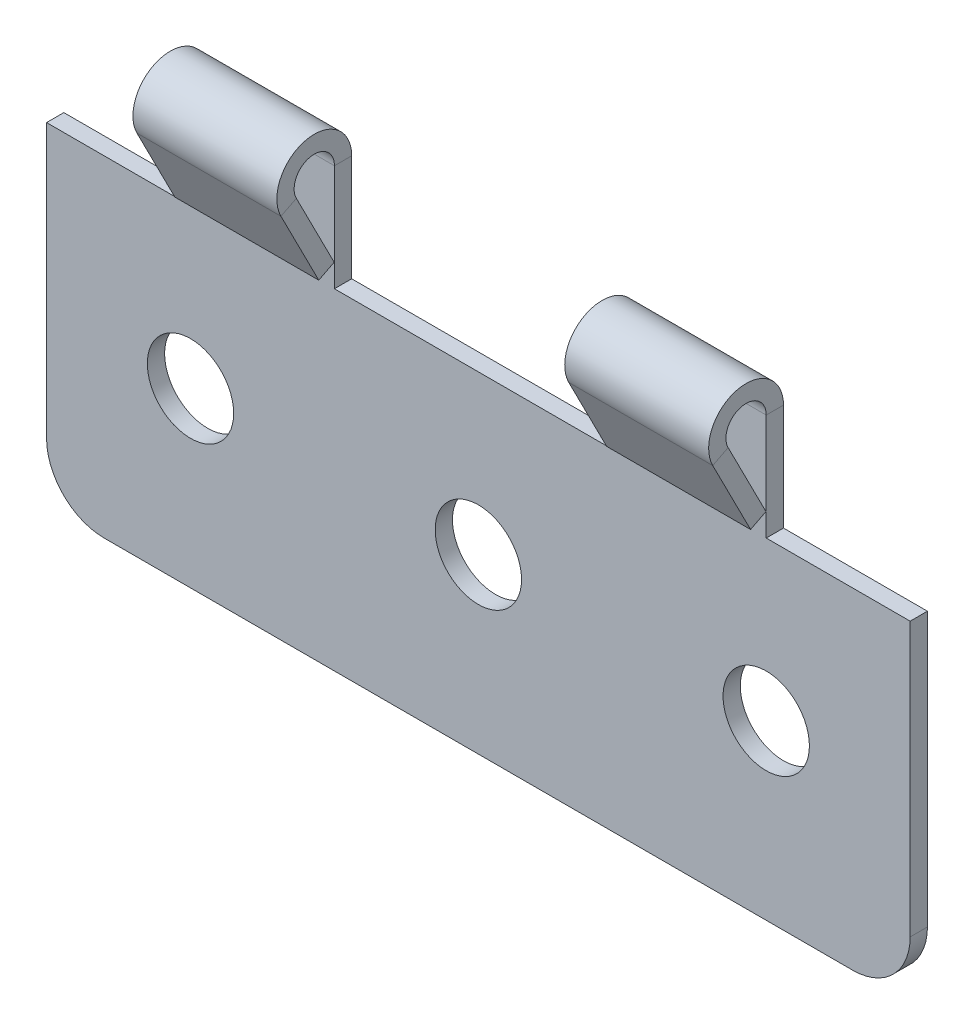
ISO-10303-21;
HEADER;
FILE_DESCRIPTION(('STEP AP214'),'2;1');
FILE_NAME('part.step','',(''),(''),'','','');
FILE_SCHEMA(('AUTOMOTIVE_DESIGN { 1 0 10303 214 1 1 1 1 }'));
ENDSEC;
DATA;
#1=APPLICATION_CONTEXT('core data for automotive mechanical design processes');
#2=APPLICATION_PROTOCOL_DEFINITION('international standard','automotive_design',2000,#1);
#3=PRODUCT_CONTEXT('',#1,'mechanical');
#4=PRODUCT('Part','Part','',(#3));
#5=PRODUCT_RELATED_PRODUCT_CATEGORY('part','',(#4));
#6=PRODUCT_DEFINITION_FORMATION('','',#4);
#7=PRODUCT_DEFINITION_CONTEXT('part definition',#1,'design');
#8=PRODUCT_DEFINITION('design','',#6,#7);
#9=PRODUCT_DEFINITION_SHAPE('','',#8);
#10=(LENGTH_UNIT() NAMED_UNIT(*) SI_UNIT(.MILLI.,.METRE.));
#11=(NAMED_UNIT(*) PLANE_ANGLE_UNIT() SI_UNIT($,.RADIAN.));
#12=(NAMED_UNIT(*) SI_UNIT($,.STERADIAN.) SOLID_ANGLE_UNIT());
#13=UNCERTAINTY_MEASURE_WITH_UNIT(LENGTH_MEASURE(1.E-05),#10,'distance_accuracy_value','');
#14=(GEOMETRIC_REPRESENTATION_CONTEXT(3) GLOBAL_UNCERTAINTY_ASSIGNED_CONTEXT((#13)) GLOBAL_UNIT_ASSIGNED_CONTEXT((#10,
#11,#12)) REPRESENTATION_CONTEXT('',''));
#15=CARTESIAN_POINT('',(0.,0.,0.));
#16=DIRECTION('',(0.,0.,1.));
#17=DIRECTION('',(1.,0.,0.));
#18=AXIS2_PLACEMENT_3D('',#15,#16,#17);
#19=CARTESIAN_POINT('',(200.,165.,-6.));
#20=DIRECTION('',(-1.,0.,0.));
#21=DIRECTION('',(0.,0.,1.));
#22=AXIS2_PLACEMENT_3D('',#19,#20,#21);
#23=PLANE('',#22);
#24=DIRECTION('',(0.,-1.,0.));
#25=VECTOR('',#24,1.);
#26=CARTESIAN_POINT('',(200.,165.,0.));
#27=LINE('',#26,#25);
#28=CARTESIAN_POINT('',(200.,152.,0.));
#29=VERTEX_POINT('',#28);
#30=CARTESIAN_POINT('',(200.,115.,0.));
#31=VERTEX_POINT('',#30);
#32=EDGE_CURVE('E331',#29,#31,#27,.T.);
#33=ORIENTED_EDGE('',*,*,#32,.F.);
#34=DIRECTION('',(0.,0.,-1.));
#35=VECTOR('',#34,1.);
#36=CARTESIAN_POINT('',(200.,152.,0.));
#37=LINE('',#36,#35);
#38=CARTESIAN_POINT('',(200.,152.,-6.00000000000003));
#39=VERTEX_POINT('',#38);
#40=EDGE_CURVE('E254',#29,#39,#37,.T.);
#41=ORIENTED_EDGE('',*,*,#40,.T.);
#42=DIRECTION('',(0.,-1.,0.));
#43=VECTOR('',#42,1.);
#44=CARTESIAN_POINT('',(200.,165.,-6.));
#45=LINE('',#44,#43);
#46=CARTESIAN_POINT('',(200.,115.,-6.));
#47=VERTEX_POINT('',#46);
#48=EDGE_CURVE('E274',#39,#47,#45,.T.);
#49=ORIENTED_EDGE('',*,*,#48,.T.);
#50=DIRECTION('',(0.,0.,1.));
#51=VECTOR('',#50,1.);
#52=CARTESIAN_POINT('',(200.,115.,-6.));
#53=LINE('',#52,#51);
#54=EDGE_CURVE('E348',#47,#31,#53,.T.);
#55=ORIENTED_EDGE('',*,*,#54,.T.);
#56=EDGE_LOOP('',(#33,#41,#49,#55));
#57=FACE_BOUND('',#56,.T.);
#58=ADVANCED_FACE('F49',(#57),#23,.T.);
#59=CARTESIAN_POINT('',(50.,115.,-6.));
#60=DIRECTION('',(-1.,0.,0.));
#61=DIRECTION('',(0.,-1.,0.));
#62=AXIS2_PLACEMENT_3D('',#59,#60,#61);
#63=PLANE('',#62);
#64=DIRECTION('',(0.,-1.,0.));
#65=VECTOR('',#64,1.);
#66=CARTESIAN_POINT('',(50.,115.,0.));
#67=LINE('',#66,#65);
#68=CARTESIAN_POINT('',(50.,152.,0.));
#69=VERTEX_POINT('',#68);
#70=CARTESIAN_POINT('',(50.,115.,0.));
#71=VERTEX_POINT('',#70);
#72=EDGE_CURVE('E342',#69,#71,#67,.T.);
#73=ORIENTED_EDGE('',*,*,#72,.F.);
#74=DIRECTION('',(0.,0.,-1.));
#75=VECTOR('',#74,1.);
#76=CARTESIAN_POINT('',(50.,152.,0.));
#77=LINE('',#76,#75);
#78=CARTESIAN_POINT('',(50.,152.,-5.99999999999998));
#79=VERTEX_POINT('',#78);
#80=EDGE_CURVE('E621',#69,#79,#77,.T.);
#81=ORIENTED_EDGE('',*,*,#80,.T.);
#82=DIRECTION('',(0.,-1.,0.));
#83=VECTOR('',#82,1.);
#84=CARTESIAN_POINT('',(50.,115.,-6.));
#85=LINE('',#84,#83);
#86=CARTESIAN_POINT('',(50.,115.,-6.));
#87=VERTEX_POINT('',#86);
#88=EDGE_CURVE('E299',#79,#87,#85,.T.);
#89=ORIENTED_EDGE('',*,*,#88,.T.);
#90=DIRECTION('',(0.,0.,1.));
#91=VECTOR('',#90,1.);
#92=CARTESIAN_POINT('',(50.,115.,-6.));
#93=LINE('',#92,#91);
#94=EDGE_CURVE('E11',#87,#71,#93,.T.);
#95=ORIENTED_EDGE('',*,*,#94,.T.);
#96=EDGE_LOOP('',(#73,#81,#89,#95));
#97=FACE_BOUND('',#96,.T.);
#98=ADVANCED_FACE('F385',(#97),#63,.T.);
#99=CARTESIAN_POINT('',(50.,115.,-6.));
#100=DIRECTION('',(0.,1.,0.));
#101=DIRECTION('',(-1.,0.,0.));
#102=AXIS2_PLACEMENT_3D('',#99,#100,#101);
#103=PLANE('',#102);
#104=DIRECTION('',(-1.,0.,0.));
#105=VECTOR('',#104,1.);
#106=CARTESIAN_POINT('',(50.,115.,0.));
#107=LINE('',#106,#105);
#108=CARTESIAN_POINT('',(0.,115.,0.));
#109=VERTEX_POINT('',#108);
#110=EDGE_CURVE('E302',#71,#109,#107,.T.);
#111=ORIENTED_EDGE('',*,*,#110,.F.);
#112=ORIENTED_EDGE('',*,*,#94,.F.);
#113=DIRECTION('',(-1.,0.,0.));
#114=VECTOR('',#113,1.);
#115=CARTESIAN_POINT('',(50.,115.,-6.));
#116=LINE('',#115,#114);
#117=CARTESIAN_POINT('',(0.,115.,-6.));
#118=VERTEX_POINT('',#117);
#119=EDGE_CURVE('E344',#87,#118,#116,.T.);
#120=ORIENTED_EDGE('',*,*,#119,.T.);
#121=DIRECTION('',(0.,0.,1.));
#122=VECTOR('',#121,1.);
#123=CARTESIAN_POINT('',(0.,115.,-6.));
#124=LINE('',#123,#122);
#125=EDGE_CURVE('E53',#118,#109,#124,.T.);
#126=ORIENTED_EDGE('',*,*,#125,.T.);
#127=EDGE_LOOP('',(#111,#112,#120,#126));
#128=FACE_BOUND('',#127,.T.);
#129=ADVANCED_FACE('F51',(#128),#103,.T.);
#130=CARTESIAN_POINT('',(100.,165.,-6.));
#131=DIRECTION('',(1.,0.,0.));
#132=DIRECTION('',(0.,0.,-1.));
#133=AXIS2_PLACEMENT_3D('',#130,#131,#132);
#134=PLANE('',#133);
#135=DIRECTION('',(0.,0.,-1.));
#136=VECTOR('',#135,1.);
#137=CARTESIAN_POINT('',(100.,152.,0.));
#138=LINE('',#137,#136);
#139=CARTESIAN_POINT('',(100.,152.,0.));
#140=VERTEX_POINT('',#139);
#141=CARTESIAN_POINT('',(100.,152.,-5.99999999999998));
#142=VERTEX_POINT('',#141);
#143=EDGE_CURVE('E633',#140,#142,#138,.T.);
#144=ORIENTED_EDGE('',*,*,#143,.F.);
#145=DIRECTION('',(0.,1.,0.));
#146=VECTOR('',#145,1.);
#147=CARTESIAN_POINT('',(100.,165.,0.));
#148=LINE('',#147,#146);
#149=CARTESIAN_POINT('',(100.,115.,0.));
#150=VERTEX_POINT('',#149);
#151=EDGE_CURVE('E338',#150,#140,#148,.T.);
#152=ORIENTED_EDGE('',*,*,#151,.F.);
#153=DIRECTION('',(0.,0.,1.));
#154=VECTOR('',#153,1.);
#155=CARTESIAN_POINT('',(100.,115.,-6.));
#156=LINE('',#155,#154);
#157=CARTESIAN_POINT('',(100.,115.,-6.));
#158=VERTEX_POINT('',#157);
#159=EDGE_CURVE('E59',#158,#150,#156,.T.);
#160=ORIENTED_EDGE('',*,*,#159,.F.);
#161=DIRECTION('',(0.,1.,0.));
#162=VECTOR('',#161,1.);
#163=CARTESIAN_POINT('',(100.,165.,-6.));
#164=LINE('',#163,#162);
#165=EDGE_CURVE('E295',#158,#142,#164,.T.);
#166=ORIENTED_EDGE('',*,*,#165,.T.);
#167=EDGE_LOOP('',(#144,#152,#160,#166));
#168=FACE_BOUND('',#167,.T.);
#169=ADVANCED_FACE('F449',(#168),#134,.T.);
#170=CARTESIAN_POINT('',(200.,115.,-6.));
#171=DIRECTION('',(0.,1.,0.));
#172=DIRECTION('',(0.,0.,1.));
#173=AXIS2_PLACEMENT_3D('',#170,#171,#172);
#174=PLANE('',#173);
#175=DIRECTION('',(-1.,0.,0.));
#176=VECTOR('',#175,1.);
#177=CARTESIAN_POINT('',(200.,115.,0.));
#178=LINE('',#177,#176);
#179=EDGE_CURVE('E334',#31,#150,#178,.T.);
#180=ORIENTED_EDGE('',*,*,#179,.F.);
#181=ORIENTED_EDGE('',*,*,#54,.F.);
#182=DIRECTION('',(-1.,0.,0.));
#183=VECTOR('',#182,1.);
#184=CARTESIAN_POINT('',(200.,115.,-6.));
#185=LINE('',#184,#183);
#186=EDGE_CURVE('E285',#47,#158,#185,.T.);
#187=ORIENTED_EDGE('',*,*,#186,.T.);
#188=ORIENTED_EDGE('',*,*,#159,.T.);
#189=EDGE_LOOP('',(#180,#181,#187,#188));
#190=FACE_BOUND('',#189,.T.);
#191=ADVANCED_FACE('F435',(#190),#174,.T.);
#192=CARTESIAN_POINT('',(250.,115.,-6.));
#193=DIRECTION('',(1.,0.,0.));
#194=DIRECTION('',(0.,0.,-1.));
#195=AXIS2_PLACEMENT_3D('',#192,#193,#194);
#196=PLANE('',#195);
#197=DIRECTION('',(0.,0.,-1.));
#198=VECTOR('',#197,1.);
#199=CARTESIAN_POINT('',(250.,152.,0.));
#200=LINE('',#199,#198);
#201=CARTESIAN_POINT('',(250.,152.,0.));
#202=VERTEX_POINT('',#201);
#203=CARTESIAN_POINT('',(250.,152.,-6.00000000000003));
#204=VERTEX_POINT('',#203);
#205=EDGE_CURVE('E241',#202,#204,#200,.T.);
#206=ORIENTED_EDGE('',*,*,#205,.F.);
#207=DIRECTION('',(0.,1.,0.));
#208=VECTOR('',#207,1.);
#209=CARTESIAN_POINT('',(250.,115.,0.));
#210=LINE('',#209,#208);
#211=CARTESIAN_POINT('',(250.,115.,0.));
#212=VERTEX_POINT('',#211);
#213=EDGE_CURVE('E328',#212,#202,#210,.T.);
#214=ORIENTED_EDGE('',*,*,#213,.F.);
#215=DIRECTION('',(0.,0.,1.));
#216=VECTOR('',#215,1.);
#217=CARTESIAN_POINT('',(250.,115.,-6.));
#218=LINE('',#217,#216);
#219=CARTESIAN_POINT('',(250.,115.,-6.));
#220=VERTEX_POINT('',#219);
#221=EDGE_CURVE('E279',#220,#212,#218,.T.);
#222=ORIENTED_EDGE('',*,*,#221,.F.);
#223=DIRECTION('',(0.,1.,0.));
#224=VECTOR('',#223,1.);
#225=CARTESIAN_POINT('',(250.,115.,-6.));
#226=LINE('',#225,#224);
#227=EDGE_CURVE('E271',#220,#204,#226,.T.);
#228=ORIENTED_EDGE('',*,*,#227,.T.);
#229=EDGE_LOOP('',(#206,#214,#222,#228));
#230=FACE_BOUND('',#229,.T.);
#231=ADVANCED_FACE('F278',(#230),#196,.T.);
#232=CARTESIAN_POINT('',(300.,115.,-6.));
#233=DIRECTION('',(0.,1.,0.));
#234=DIRECTION('',(0.,0.,1.));
#235=AXIS2_PLACEMENT_3D('',#232,#233,#234);
#236=PLANE('',#235);
#237=DIRECTION('',(-1.,0.,0.));
#238=VECTOR('',#237,1.);
#239=CARTESIAN_POINT('',(300.,115.,0.));
#240=LINE('',#239,#238);
#241=CARTESIAN_POINT('',(300.,115.,0.));
#242=VERTEX_POINT('',#241);
#243=EDGE_CURVE('E324',#242,#212,#240,.T.);
#244=ORIENTED_EDGE('',*,*,#243,.F.);
#245=DIRECTION('',(0.,0.,1.));
#246=VECTOR('',#245,1.);
#247=CARTESIAN_POINT('',(300.,115.,-6.));
#248=LINE('',#247,#246);
#249=CARTESIAN_POINT('',(300.,115.,-6.));
#250=VERTEX_POINT('',#249);
#251=EDGE_CURVE('E354',#250,#242,#248,.T.);
#252=ORIENTED_EDGE('',*,*,#251,.F.);
#253=DIRECTION('',(-1.,0.,0.));
#254=VECTOR('',#253,1.);
#255=CARTESIAN_POINT('',(300.,115.,-6.));
#256=LINE('',#255,#254);
#257=EDGE_CURVE('E281',#250,#220,#256,.T.);
#258=ORIENTED_EDGE('',*,*,#257,.T.);
#259=ORIENTED_EDGE('',*,*,#221,.T.);
#260=EDGE_LOOP('',(#244,#252,#258,#259));
#261=FACE_BOUND('',#260,.T.);
#262=ADVANCED_FACE('F426',(#261),#236,.T.);
#263=CARTESIAN_POINT('',(300.,20.0000000000001,-6.));
#264=DIRECTION('',(1.,0.,0.));
#265=DIRECTION('',(0.,0.,-1.));
#266=AXIS2_PLACEMENT_3D('',#263,#264,#265);
#267=PLANE('',#266);
#268=DIRECTION('',(0.,1.,0.));
#269=VECTOR('',#268,1.);
#270=CARTESIAN_POINT('',(300.,20.0000000000001,0.));
#271=LINE('',#270,#269);
#272=CARTESIAN_POINT('',(300.,20.,0.));
#273=VERTEX_POINT('',#272);
#274=EDGE_CURVE('E320',#273,#242,#271,.T.);
#275=ORIENTED_EDGE('',*,*,#274,.F.);
#276=DIRECTION('',(0.,0.,1.));
#277=VECTOR('',#276,1.);
#278=CARTESIAN_POINT('',(300.,20.,-6.));
#279=LINE('',#278,#277);
#280=CARTESIAN_POINT('',(300.,20.,-6.));
#281=VERTEX_POINT('',#280);
#282=EDGE_CURVE('E357',#281,#273,#279,.T.);
#283=ORIENTED_EDGE('',*,*,#282,.F.);
#284=DIRECTION('',(0.,1.,0.));
#285=VECTOR('',#284,1.);
#286=CARTESIAN_POINT('',(300.,20.0000000000001,-6.));
#287=LINE('',#286,#285);
#288=EDGE_CURVE('E288',#281,#250,#287,.T.);
#289=ORIENTED_EDGE('',*,*,#288,.T.);
#290=ORIENTED_EDGE('',*,*,#251,.T.);
#291=EDGE_LOOP('',(#275,#283,#289,#290));
#292=FACE_BOUND('',#291,.T.);
#293=ADVANCED_FACE('F412',(#292),#267,.T.);
#294=CARTESIAN_POINT('',(280.,20.,-6.));
#295=DIRECTION('',(0.,0.,1.));
#296=DIRECTION('',(1.,0.,0.));
#297=AXIS2_PLACEMENT_3D('',#294,#295,#296);
#298=CYLINDRICAL_SURFACE('',#297,20.);
#299=CARTESIAN_POINT('',(280.,20.,0.));
#300=DIRECTION('',(0.,0.,1.));
#301=DIRECTION('',(1.,0.,0.));
#302=AXIS2_PLACEMENT_3D('',#299,#300,#301);
#303=CIRCLE('',#302,20.);
#304=CARTESIAN_POINT('',(280.,0.,0.));
#305=VERTEX_POINT('',#304);
#306=EDGE_CURVE('E317',#305,#273,#303,.T.);
#307=ORIENTED_EDGE('',*,*,#306,.F.);
#308=DIRECTION('',(0.,0.,1.));
#309=VECTOR('',#308,1.);
#310=CARTESIAN_POINT('',(280.,0.,-6.));
#311=LINE('',#310,#309);
#312=CARTESIAN_POINT('',(280.,0.,-6.));
#313=VERTEX_POINT('',#312);
#314=EDGE_CURVE('E359',#313,#305,#311,.T.);
#315=ORIENTED_EDGE('',*,*,#314,.F.);
#316=CARTESIAN_POINT('',(280.,20.,-6.));
#317=DIRECTION('',(0.,0.,1.));
#318=DIRECTION('',(1.,0.,0.));
#319=AXIS2_PLACEMENT_3D('',#316,#317,#318);
#320=CIRCLE('',#319,20.);
#321=EDGE_CURVE('E404',#313,#281,#320,.T.);
#322=ORIENTED_EDGE('',*,*,#321,.T.);
#323=ORIENTED_EDGE('',*,*,#282,.T.);
#324=EDGE_LOOP('',(#307,#315,#322,#323));
#325=FACE_BOUND('',#324,.T.);
#326=ADVANCED_FACE('F418',(#325),#298,.T.);
#327=CARTESIAN_POINT('',(20.0000000000001,0.,-6.));
#328=DIRECTION('',(0.,-1.,0.));
#329=DIRECTION('',(0.,0.,-1.));
#330=AXIS2_PLACEMENT_3D('',#327,#328,#329);
#331=PLANE('',#330);
#332=DIRECTION('',(1.,0.,0.));
#333=VECTOR('',#332,1.);
#334=CARTESIAN_POINT('',(20.0000000000001,0.,0.));
#335=LINE('',#334,#333);
#336=CARTESIAN_POINT('',(20.0000000000001,0.,0.));
#337=VERTEX_POINT('',#336);
#338=EDGE_CURVE('E314',#337,#305,#335,.T.);
#339=ORIENTED_EDGE('',*,*,#338,.F.);
#340=DIRECTION('',(0.,0.,1.));
#341=VECTOR('',#340,1.);
#342=CARTESIAN_POINT('',(20.0000000000001,0.,-6.));
#343=LINE('',#342,#341);
#344=CARTESIAN_POINT('',(20.0000000000001,0.,-6.));
#345=VERTEX_POINT('',#344);
#346=EDGE_CURVE('E362',#345,#337,#343,.T.);
#347=ORIENTED_EDGE('',*,*,#346,.F.);
#348=DIRECTION('',(1.,0.,0.));
#349=VECTOR('',#348,1.);
#350=CARTESIAN_POINT('',(20.0000000000001,0.,-6.));
#351=LINE('',#350,#349);
#352=EDGE_CURVE('E400',#345,#313,#351,.T.);
#353=ORIENTED_EDGE('',*,*,#352,.T.);
#354=ORIENTED_EDGE('',*,*,#314,.T.);
#355=EDGE_LOOP('',(#339,#347,#353,#354));
#356=FACE_BOUND('',#355,.T.);
#357=ADVANCED_FACE('F421',(#356),#331,.T.);
#358=CARTESIAN_POINT('',(20.,20.,-6.));
#359=DIRECTION('',(0.,0.,1.));
#360=DIRECTION('',(1.,0.,0.));
#361=AXIS2_PLACEMENT_3D('',#358,#359,#360);
#362=CYLINDRICAL_SURFACE('',#361,20.);
#363=CARTESIAN_POINT('',(20.,20.,0.));
#364=DIRECTION('',(0.,0.,1.));
#365=DIRECTION('',(-1.,0.,0.));
#366=AXIS2_PLACEMENT_3D('',#363,#364,#365);
#367=CIRCLE('',#366,20.);
#368=CARTESIAN_POINT('',(0.,20.0000000000001,0.));
#369=VERTEX_POINT('',#368);
#370=EDGE_CURVE('E311',#369,#337,#367,.T.);
#371=ORIENTED_EDGE('',*,*,#370,.F.);
#372=DIRECTION('',(0.,0.,1.));
#373=VECTOR('',#372,1.);
#374=CARTESIAN_POINT('',(0.,20.0000000000001,-6.));
#375=LINE('',#374,#373);
#376=CARTESIAN_POINT('',(0.,20.0000000000001,-6.));
#377=VERTEX_POINT('',#376);
#378=EDGE_CURVE('E363',#377,#369,#375,.T.);
#379=ORIENTED_EDGE('',*,*,#378,.F.);
#380=CARTESIAN_POINT('',(20.,20.,-6.));
#381=DIRECTION('',(0.,0.,1.));
#382=DIRECTION('',(-1.,0.,0.));
#383=AXIS2_PLACEMENT_3D('',#380,#381,#382);
#384=CIRCLE('',#383,20.);
#385=EDGE_CURVE('E392',#377,#345,#384,.T.);
#386=ORIENTED_EDGE('',*,*,#385,.T.);
#387=ORIENTED_EDGE('',*,*,#346,.T.);
#388=EDGE_LOOP('',(#371,#379,#386,#387));
#389=FACE_BOUND('',#388,.T.);
#390=ADVANCED_FACE('F423',(#389),#362,.T.);
#391=CARTESIAN_POINT('',(0.,115.,-6.));
#392=DIRECTION('',(-1.,0.,0.));
#393=DIRECTION('',(0.,-1.,0.));
#394=AXIS2_PLACEMENT_3D('',#391,#392,#393);
#395=PLANE('',#394);
#396=DIRECTION('',(0.,-1.,0.));
#397=VECTOR('',#396,1.);
#398=CARTESIAN_POINT('',(0.,115.,0.));
#399=LINE('',#398,#397);
#400=EDGE_CURVE('E306',#109,#369,#399,.T.);
#401=ORIENTED_EDGE('',*,*,#400,.F.);
#402=ORIENTED_EDGE('',*,*,#125,.F.);
#403=DIRECTION('',(0.,-1.,0.));
#404=VECTOR('',#403,1.);
#405=CARTESIAN_POINT('',(0.,115.,-6.));
#406=LINE('',#405,#404);
#407=EDGE_CURVE('E389',#118,#377,#406,.T.);
#408=ORIENTED_EDGE('',*,*,#407,.T.);
#409=ORIENTED_EDGE('',*,*,#378,.T.);
#410=EDGE_LOOP('',(#401,#402,#408,#409));
#411=FACE_BOUND('',#410,.T.);
#412=ADVANCED_FACE('F377',(#411),#395,.T.);
#413=CARTESIAN_POINT('',(20.,20.,-6.));
#414=DIRECTION('',(0.,0.,-1.));
#415=DIRECTION('',(-1.,0.,0.));
#416=AXIS2_PLACEMENT_3D('',#413,#414,#415);
#417=PLANE('',#416);
#418=CARTESIAN_POINT('',(250.,60.,-6.));
#419=DIRECTION('',(0.,0.,-1.));
#420=DIRECTION('',(-1.,0.,0.));
#421=AXIS2_PLACEMENT_3D('',#418,#419,#420);
#422=CIRCLE('',#421,15.);
#423=CARTESIAN_POINT('',(235.,60.,-6.));
#424=VERTEX_POINT('',#423);
#425=EDGE_CURVE('E537',#424,#424,#422,.T.);
#426=ORIENTED_EDGE('',*,*,#425,.F.);
#427=EDGE_LOOP('',(#426));
#428=FACE_BOUND('',#427,.T.);
#429=CARTESIAN_POINT('',(150.,60.,-6.));
#430=DIRECTION('',(0.,0.,-1.));
#431=DIRECTION('',(-1.,0.,0.));
#432=AXIS2_PLACEMENT_3D('',#429,#430,#431);
#433=CIRCLE('',#432,15.);
#434=CARTESIAN_POINT('',(135.,60.,-6.));
#435=VERTEX_POINT('',#434);
#436=EDGE_CURVE('E548',#435,#435,#433,.T.);
#437=ORIENTED_EDGE('',*,*,#436,.F.);
#438=EDGE_LOOP('',(#437));
#439=FACE_BOUND('',#438,.T.);
#440=CARTESIAN_POINT('',(50.,60.,-6.));
#441=DIRECTION('',(0.,0.,-1.));
#442=DIRECTION('',(-1.,0.,0.));
#443=AXIS2_PLACEMENT_3D('',#440,#441,#442);
#444=CIRCLE('',#443,15.);
#445=CARTESIAN_POINT('',(35.,60.,-6.));
#446=VERTEX_POINT('',#445);
#447=EDGE_CURVE('E542',#446,#446,#444,.T.);
#448=ORIENTED_EDGE('',*,*,#447,.F.);
#449=EDGE_LOOP('',(#448));
#450=FACE_BOUND('',#449,.T.);
#451=DIRECTION('',(-1.,0.,0.));
#452=VECTOR('',#451,1.);
#453=CARTESIAN_POINT('',(200.,152.,-6.00000000000003));
#454=LINE('',#453,#452);
#455=EDGE_CURVE('E261',#39,#204,#454,.F.);
#456=ORIENTED_EDGE('',*,*,#455,.T.);
#457=ORIENTED_EDGE('',*,*,#227,.F.);
#458=ORIENTED_EDGE('',*,*,#257,.F.);
#459=ORIENTED_EDGE('',*,*,#288,.F.);
#460=ORIENTED_EDGE('',*,*,#321,.F.);
#461=ORIENTED_EDGE('',*,*,#352,.F.);
#462=ORIENTED_EDGE('',*,*,#385,.F.);
#463=ORIENTED_EDGE('',*,*,#407,.F.);
#464=ORIENTED_EDGE('',*,*,#119,.F.);
#465=ORIENTED_EDGE('',*,*,#88,.F.);
#466=DIRECTION('',(-1.,0.,0.));
#467=VECTOR('',#466,1.);
#468=CARTESIAN_POINT('',(50.,152.,-5.99999999999998));
#469=LINE('',#468,#467);
#470=EDGE_CURVE('E613',#79,#142,#469,.F.);
#471=ORIENTED_EDGE('',*,*,#470,.T.);
#472=ORIENTED_EDGE('',*,*,#165,.F.);
#473=ORIENTED_EDGE('',*,*,#186,.F.);
#474=ORIENTED_EDGE('',*,*,#48,.F.);
#475=EDGE_LOOP('',(#456,#457,#458,#459,#460,#461,#462,#463,#464,#465,#471,#472,#473,#474));
#476=FACE_BOUND('',#475,.T.);
#477=ADVANCED_FACE('F269',(#428,#439,#450,#476),#417,.T.);
#478=CARTESIAN_POINT('',(20.,20.,0.));
#479=DIRECTION('',(0.,0.,-1.));
#480=DIRECTION('',(-1.,0.,0.));
#481=AXIS2_PLACEMENT_3D('',#478,#479,#480);
#482=PLANE('',#481);
#483=CARTESIAN_POINT('',(250.,60.,0.));
#484=DIRECTION('',(0.,0.,1.));
#485=DIRECTION('',(1.,0.,0.));
#486=AXIS2_PLACEMENT_3D('',#483,#484,#485);
#487=CIRCLE('',#486,15.);
#488=CARTESIAN_POINT('',(265.,60.,0.));
#489=VERTEX_POINT('',#488);
#490=EDGE_CURVE('E540',#489,#489,#487,.T.);
#491=ORIENTED_EDGE('',*,*,#490,.F.);
#492=EDGE_LOOP('',(#491));
#493=FACE_BOUND('',#492,.T.);
#494=CARTESIAN_POINT('',(150.,60.,0.));
#495=DIRECTION('',(0.,0.,1.));
#496=DIRECTION('',(1.,0.,0.));
#497=AXIS2_PLACEMENT_3D('',#494,#495,#496);
#498=CIRCLE('',#497,15.);
#499=CARTESIAN_POINT('',(165.,60.,0.));
#500=VERTEX_POINT('',#499);
#501=EDGE_CURVE('E543',#500,#500,#498,.T.);
#502=ORIENTED_EDGE('',*,*,#501,.F.);
#503=EDGE_LOOP('',(#502));
#504=FACE_BOUND('',#503,.T.);
#505=CARTESIAN_POINT('',(50.,60.,0.));
#506=DIRECTION('',(0.,0.,1.));
#507=DIRECTION('',(1.,0.,0.));
#508=AXIS2_PLACEMENT_3D('',#505,#506,#507);
#509=CIRCLE('',#508,15.);
#510=CARTESIAN_POINT('',(65.,60.,0.));
#511=VERTEX_POINT('',#510);
#512=EDGE_CURVE('E552',#511,#511,#509,.T.);
#513=ORIENTED_EDGE('',*,*,#512,.F.);
#514=EDGE_LOOP('',(#513));
#515=FACE_BOUND('',#514,.T.);
#516=ORIENTED_EDGE('',*,*,#213,.T.);
#517=DIRECTION('',(-1.,0.,0.));
#518=VECTOR('',#517,1.);
#519=CARTESIAN_POINT('',(200.,152.,0.));
#520=LINE('',#519,#518);
#521=EDGE_CURVE('E566',#29,#202,#520,.F.);
#522=ORIENTED_EDGE('',*,*,#521,.F.);
#523=ORIENTED_EDGE('',*,*,#32,.T.);
#524=ORIENTED_EDGE('',*,*,#179,.T.);
#525=ORIENTED_EDGE('',*,*,#151,.T.);
#526=DIRECTION('',(-1.,0.,0.));
#527=VECTOR('',#526,1.);
#528=CARTESIAN_POINT('',(50.,152.,0.));
#529=LINE('',#528,#527);
#530=EDGE_CURVE('E382',#69,#140,#529,.F.);
#531=ORIENTED_EDGE('',*,*,#530,.F.);
#532=ORIENTED_EDGE('',*,*,#72,.T.);
#533=ORIENTED_EDGE('',*,*,#110,.T.);
#534=ORIENTED_EDGE('',*,*,#400,.T.);
#535=ORIENTED_EDGE('',*,*,#370,.T.);
#536=ORIENTED_EDGE('',*,*,#338,.T.);
#537=ORIENTED_EDGE('',*,*,#306,.T.);
#538=ORIENTED_EDGE('',*,*,#274,.T.);
#539=ORIENTED_EDGE('',*,*,#243,.T.);
#540=EDGE_LOOP('',(#516,#522,#523,#524,#525,#531,#532,#533,#534,#535,#536,#537,#538,#539));
#541=FACE_BOUND('',#540,.T.);
#542=ADVANCED_FACE('F379',(#493,#504,#515,#541),#482,.F.);
#543=CARTESIAN_POINT('',(50.,133.197641709576,12.0099610297632));
#544=DIRECTION('',(1.,0.,0.));
#545=DIRECTION('',(0.,0.891006524188364,0.453990499739555));
#546=AXIS2_PLACEMENT_3D('',#543,#544,#545);
#547=PLANE('',#546);
#548=DIRECTION('',(0.,-0.453990499739555,0.891006524188364));
#549=VECTOR('',#548,1.);
#550=CARTESIAN_POINT('',(50.,146.098123503386,18.5830848144487));
#551=LINE('',#550,#549);
#552=CARTESIAN_POINT('',(50.,148.822066501823,13.2370456693186));
#553=VERTEX_POINT('',#552);
#554=CARTESIAN_POINT('',(50.,146.098123503386,18.5830848144487));
#555=VERTEX_POINT('',#554);
#556=EDGE_CURVE('E672',#553,#555,#551,.T.);
#557=ORIENTED_EDGE('',*,*,#556,.F.);
#558=DIRECTION('',(0.,-0.891006524188364,-0.453990499739555));
#559=VECTOR('',#558,1.);
#560=CARTESIAN_POINT('',(50.,135.921584708014,6.66392188463302));
#561=LINE('',#560,#559);
#562=CARTESIAN_POINT('',(50.,123.021102914204,0.0907980999474778));
#563=VERTEX_POINT('',#562);
#564=EDGE_CURVE('E659',#563,#553,#561,.F.);
#565=ORIENTED_EDGE('',*,*,#564,.F.);
#566=DIRECTION('',(0.,-0.453990499739555,0.891006524188364));
#567=VECTOR('',#566,1.);
#568=CARTESIAN_POINT('',(50.,120.297159915767,5.43683724507766));
#569=LINE('',#568,#567);
#570=CARTESIAN_POINT('',(50.,120.297159915767,5.43683724507766));
#571=VERTEX_POINT('',#570);
#572=EDGE_CURVE('E669',#563,#571,#569,.T.);
#573=ORIENTED_EDGE('',*,*,#572,.T.);
#574=DIRECTION('',(0.,0.891006524188364,0.453990499739555));
#575=VECTOR('',#574,1.);
#576=CARTESIAN_POINT('',(50.,133.197641709576,12.0099610297632));
#577=LINE('',#576,#575);
#578=EDGE_CURVE('E643',#571,#555,#577,.T.);
#579=ORIENTED_EDGE('',*,*,#578,.T.);
#580=EDGE_LOOP('',(#557,#565,#573,#579));
#581=FACE_BOUND('',#580,.T.);
#582=ADVANCED_FACE('F456',(#581),#547,.F.);
#583=CARTESIAN_POINT('',(75.,120.297159915767,5.43683724507766));
#584=DIRECTION('',(0.,0.891006524188364,0.453990499739555));
#585=DIRECTION('',(-1.,0.,0.));
#586=AXIS2_PLACEMENT_3D('',#583,#584,#585);
#587=PLANE('',#586);
#588=ORIENTED_EDGE('',*,*,#572,.F.);
#589=DIRECTION('',(1.,0.,0.));
#590=VECTOR('',#589,1.);
#591=CARTESIAN_POINT('',(75.,123.021102914204,0.0907980999474778));
#592=LINE('',#591,#590);
#593=CARTESIAN_POINT('',(100.,123.021102914204,0.0907980999474778));
#594=VERTEX_POINT('',#593);
#595=EDGE_CURVE('E655',#594,#563,#592,.F.);
#596=ORIENTED_EDGE('',*,*,#595,.F.);
#597=DIRECTION('',(0.,-0.453990499739555,0.891006524188364));
#598=VECTOR('',#597,1.);
#599=CARTESIAN_POINT('',(100.,120.297159915767,5.43683724507766));
#600=LINE('',#599,#598);
#601=CARTESIAN_POINT('',(100.,120.297159915767,5.43683724507766));
#602=VERTEX_POINT('',#601);
#603=EDGE_CURVE('E395',#594,#602,#600,.T.);
#604=ORIENTED_EDGE('',*,*,#603,.T.);
#605=DIRECTION('',(-1.,0.,0.));
#606=VECTOR('',#605,1.);
#607=CARTESIAN_POINT('',(75.,120.297159915767,5.43683724507766));
#608=LINE('',#607,#606);
#609=EDGE_CURVE('E639',#602,#571,#608,.T.);
#610=ORIENTED_EDGE('',*,*,#609,.T.);
#611=EDGE_LOOP('',(#588,#596,#604,#610));
#612=FACE_BOUND('',#611,.T.);
#613=ADVANCED_FACE('F465',(#612),#587,.F.);
#614=CARTESIAN_POINT('',(100.,133.197641709576,12.0099610297632));
#615=DIRECTION('',(-1.,0.,0.));
#616=DIRECTION('',(0.,-0.891006524188364,-0.453990499739555));
#617=AXIS2_PLACEMENT_3D('',#614,#615,#616);
#618=PLANE('',#617);
#619=DIRECTION('',(0.,-0.891006524188364,-0.453990499739555));
#620=VECTOR('',#619,1.);
#621=CARTESIAN_POINT('',(100.,135.921584708014,6.66392188463302));
#622=LINE('',#621,#620);
#623=CARTESIAN_POINT('',(100.,148.822066501823,13.2370456693186));
#624=VERTEX_POINT('',#623);
#625=EDGE_CURVE('E636',#624,#594,#622,.T.);
#626=ORIENTED_EDGE('',*,*,#625,.F.);
#627=DIRECTION('',(0.,-0.453990499739555,0.891006524188364));
#628=VECTOR('',#627,1.);
#629=CARTESIAN_POINT('',(100.,146.098123503386,18.5830848144487));
#630=LINE('',#629,#628);
#631=CARTESIAN_POINT('',(100.,146.098123503386,18.5830848144487));
#632=VERTEX_POINT('',#631);
#633=EDGE_CURVE('E307',#624,#632,#630,.T.);
#634=ORIENTED_EDGE('',*,*,#633,.T.);
#635=DIRECTION('',(0.,-0.891006524188364,-0.453990499739555));
#636=VECTOR('',#635,1.);
#637=CARTESIAN_POINT('',(100.,133.197641709576,12.0099610297632));
#638=LINE('',#637,#636);
#639=EDGE_CURVE('E651',#632,#602,#638,.T.);
#640=ORIENTED_EDGE('',*,*,#639,.T.);
#641=ORIENTED_EDGE('',*,*,#603,.F.);
#642=EDGE_LOOP('',(#626,#634,#640,#641));
#643=FACE_BOUND('',#642,.T.);
#644=ADVANCED_FACE('F461',(#643),#618,.F.);
#645=CARTESIAN_POINT('',(75.,133.197641709576,12.0099610297632));
#646=DIRECTION('',(0.,-0.453990499739555,0.891006524188364));
#647=DIRECTION('',(0.,-0.891006524188364,-0.453990499739555));
#648=AXIS2_PLACEMENT_3D('',#645,#646,#647);
#649=PLANE('',#648);
#650=ORIENTED_EDGE('',*,*,#609,.F.);
#651=ORIENTED_EDGE('',*,*,#639,.F.);
#652=DIRECTION('',(1.,0.,0.));
#653=VECTOR('',#652,1.);
#654=CARTESIAN_POINT('',(75.,146.098123503386,18.5830848144487));
#655=LINE('',#654,#653);
#656=EDGE_CURVE('E647',#555,#632,#655,.T.);
#657=ORIENTED_EDGE('',*,*,#656,.F.);
#658=ORIENTED_EDGE('',*,*,#578,.F.);
#659=EDGE_LOOP('',(#650,#651,#657,#658));
#660=FACE_BOUND('',#659,.T.);
#661=ADVANCED_FACE('F464',(#660),#649,.T.);
#662=CARTESIAN_POINT('',(75.,135.921584708014,6.66392188463302));
#663=DIRECTION('',(0.,-0.453990499739555,0.891006524188364));
#664=DIRECTION('',(0.,-0.891006524188364,-0.453990499739555));
#665=AXIS2_PLACEMENT_3D('',#662,#663,#664);
#666=PLANE('',#665);
#667=ORIENTED_EDGE('',*,*,#595,.T.);
#668=ORIENTED_EDGE('',*,*,#564,.T.);
#669=DIRECTION('',(1.,0.,0.));
#670=VECTOR('',#669,1.);
#671=CARTESIAN_POINT('',(75.,148.822066501823,13.2370456693186));
#672=LINE('',#671,#670);
#673=EDGE_CURVE('E663',#553,#624,#672,.T.);
#674=ORIENTED_EDGE('',*,*,#673,.T.);
#675=ORIENTED_EDGE('',*,*,#625,.T.);
#676=EDGE_LOOP('',(#667,#668,#674,#675));
#677=FACE_BOUND('',#676,.T.);
#678=ADVANCED_FACE('F473',(#677),#666,.F.);
#679=CARTESIAN_POINT('',(100.,152.,7.00000000000002));
#680=DIRECTION('',(1.,0.,0.));
#681=DIRECTION('',(0.,0.,-1.));
#682=AXIS2_PLACEMENT_3D('',#679,#680,#681);
#683=PLANE('',#682);
#684=ORIENTED_EDGE('',*,*,#633,.F.);
#685=CARTESIAN_POINT('',(100.,152.,7.00000000000002));
#686=DIRECTION('',(-1.,0.,0.));
#687=DIRECTION('',(0.,0.,1.));
#688=AXIS2_PLACEMENT_3D('',#685,#686,#687);
#689=CIRCLE('',#688,6.99999999999999);
#690=EDGE_CURVE('E625',#140,#624,#689,.F.);
#691=ORIENTED_EDGE('',*,*,#690,.F.);
#692=ORIENTED_EDGE('',*,*,#143,.T.);
#693=CARTESIAN_POINT('',(100.,152.,7.00000000000002));
#694=DIRECTION('',(-1.,0.,0.));
#695=DIRECTION('',(0.,0.,1.));
#696=AXIS2_PLACEMENT_3D('',#693,#694,#695);
#697=CIRCLE('',#696,13.);
#698=EDGE_CURVE('E616',#142,#632,#697,.F.);
#699=ORIENTED_EDGE('',*,*,#698,.T.);
#700=EDGE_LOOP('',(#684,#691,#692,#699));
#701=FACE_BOUND('',#700,.T.);
#702=ADVANCED_FACE('F476',(#701),#683,.T.);
#703=CARTESIAN_POINT('',(50.,152.,7.00000000000002));
#704=DIRECTION('',(1.,0.,0.));
#705=DIRECTION('',(0.,0.,-1.));
#706=AXIS2_PLACEMENT_3D('',#703,#704,#705);
#707=PLANE('',#706);
#708=CARTESIAN_POINT('',(50.,152.,7.00000000000002));
#709=DIRECTION('',(-1.,0.,0.));
#710=DIRECTION('',(0.,0.,1.));
#711=AXIS2_PLACEMENT_3D('',#708,#709,#710);
#712=CIRCLE('',#711,6.99999999999999);
#713=EDGE_CURVE('E81',#553,#69,#712,.T.);
#714=ORIENTED_EDGE('',*,*,#713,.F.);
#715=ORIENTED_EDGE('',*,*,#556,.T.);
#716=CARTESIAN_POINT('',(50.,152.,7.00000000000002));
#717=DIRECTION('',(-1.,0.,0.));
#718=DIRECTION('',(0.,0.,1.));
#719=AXIS2_PLACEMENT_3D('',#716,#717,#718);
#720=CIRCLE('',#719,13.);
#721=EDGE_CURVE('E617',#555,#79,#720,.T.);
#722=ORIENTED_EDGE('',*,*,#721,.T.);
#723=ORIENTED_EDGE('',*,*,#80,.F.);
#724=EDGE_LOOP('',(#714,#715,#722,#723));
#725=FACE_BOUND('',#724,.T.);
#726=ADVANCED_FACE('F481',(#725),#707,.F.);
#727=CARTESIAN_POINT('',(50.,152.,7.00000000000002));
#728=DIRECTION('',(-1.,0.,0.));
#729=DIRECTION('',(0.,-0.453990499739555,0.891006524188364));
#730=AXIS2_PLACEMENT_3D('',#727,#728,#729);
#731=CYLINDRICAL_SURFACE('',#730,13.);
#732=ORIENTED_EDGE('',*,*,#470,.F.);
#733=ORIENTED_EDGE('',*,*,#721,.F.);
#734=ORIENTED_EDGE('',*,*,#656,.T.);
#735=ORIENTED_EDGE('',*,*,#698,.F.);
#736=EDGE_LOOP('',(#732,#733,#734,#735));
#737=FACE_BOUND('',#736,.T.);
#738=ADVANCED_FACE('F484',(#737),#731,.T.);
#739=CARTESIAN_POINT('',(50.,152.,7.00000000000002));
#740=DIRECTION('',(-1.,0.,0.));
#741=DIRECTION('',(0.,-0.453990499739555,0.891006524188364));
#742=AXIS2_PLACEMENT_3D('',#739,#740,#741);
#743=CYLINDRICAL_SURFACE('',#742,6.99999999999999);
#744=ORIENTED_EDGE('',*,*,#530,.T.);
#745=ORIENTED_EDGE('',*,*,#690,.T.);
#746=ORIENTED_EDGE('',*,*,#673,.F.);
#747=ORIENTED_EDGE('',*,*,#713,.T.);
#748=EDGE_LOOP('',(#744,#745,#746,#747));
#749=FACE_BOUND('',#748,.T.);
#750=ADVANCED_FACE('F489',(#749),#743,.F.);
#751=CARTESIAN_POINT('',(200.,133.197641709576,12.0099610297632));
#752=DIRECTION('',(1.,0.,0.));
#753=DIRECTION('',(0.,0.891006524188365,0.453990499739553));
#754=AXIS2_PLACEMENT_3D('',#751,#752,#753);
#755=PLANE('',#754);
#756=DIRECTION('',(0.,-0.453990499739553,0.891006524188365));
#757=VECTOR('',#756,1.);
#758=CARTESIAN_POINT('',(200.,146.098123503386,18.5830848144487));
#759=LINE('',#758,#757);
#760=CARTESIAN_POINT('',(200.,148.822066501823,13.2370456693186));
#761=VERTEX_POINT('',#760);
#762=CARTESIAN_POINT('',(200.,146.098123503386,18.5830848144487));
#763=VERTEX_POINT('',#762);
#764=EDGE_CURVE('E604',#761,#763,#759,.T.);
#765=ORIENTED_EDGE('',*,*,#764,.F.);
#766=DIRECTION('',(0.,-0.891006524188365,-0.453990499739553));
#767=VECTOR('',#766,1.);
#768=CARTESIAN_POINT('',(200.,135.921584708014,6.66392188463304));
#769=LINE('',#768,#767);
#770=CARTESIAN_POINT('',(200.,123.021102914204,0.0907980999475229));
#771=VERTEX_POINT('',#770);
#772=EDGE_CURVE('E591',#771,#761,#769,.F.);
#773=ORIENTED_EDGE('',*,*,#772,.F.);
#774=DIRECTION('',(0.,-0.453990499739553,0.891006524188365));
#775=VECTOR('',#774,1.);
#776=CARTESIAN_POINT('',(200.,120.297159915767,5.43683724507771));
#777=LINE('',#776,#775);
#778=CARTESIAN_POINT('',(200.,120.297159915767,5.43683724507771));
#779=VERTEX_POINT('',#778);
#780=EDGE_CURVE('E601',#771,#779,#777,.T.);
#781=ORIENTED_EDGE('',*,*,#780,.T.);
#782=DIRECTION('',(0.,0.891006524188365,0.453990499739553));
#783=VECTOR('',#782,1.);
#784=CARTESIAN_POINT('',(200.,133.197641709576,12.0099610297632));
#785=LINE('',#784,#783);
#786=EDGE_CURVE('E579',#779,#763,#785,.T.);
#787=ORIENTED_EDGE('',*,*,#786,.T.);
#788=EDGE_LOOP('',(#765,#773,#781,#787));
#789=FACE_BOUND('',#788,.T.);
#790=ADVANCED_FACE('F492',(#789),#755,.F.);
#791=CARTESIAN_POINT('',(225.,120.297159915767,5.43683724507771));
#792=DIRECTION('',(0.,0.891006524188365,0.453990499739553));
#793=DIRECTION('',(-1.,0.,0.));
#794=AXIS2_PLACEMENT_3D('',#791,#792,#793);
#795=PLANE('',#794);
#796=ORIENTED_EDGE('',*,*,#780,.F.);
#797=DIRECTION('',(1.,0.,0.));
#798=VECTOR('',#797,1.);
#799=CARTESIAN_POINT('',(225.,123.021102914204,0.0907980999475229));
#800=LINE('',#799,#798);
#801=CARTESIAN_POINT('',(250.,123.021102914204,0.0907980999475229));
#802=VERTEX_POINT('',#801);
#803=EDGE_CURVE('E587',#802,#771,#800,.F.);
#804=ORIENTED_EDGE('',*,*,#803,.F.);
#805=DIRECTION('',(0.,-0.453990499739553,0.891006524188365));
#806=VECTOR('',#805,1.);
#807=CARTESIAN_POINT('',(250.,120.297159915767,5.43683724507771));
#808=LINE('',#807,#806);
#809=CARTESIAN_POINT('',(250.,120.297159915767,5.43683724507771));
#810=VERTEX_POINT('',#809);
#811=EDGE_CURVE('E578',#802,#810,#808,.T.);
#812=ORIENTED_EDGE('',*,*,#811,.T.);
#813=DIRECTION('',(-1.,0.,0.));
#814=VECTOR('',#813,1.);
#815=CARTESIAN_POINT('',(225.,120.297159915767,5.43683724507771));
#816=LINE('',#815,#814);
#817=EDGE_CURVE('E574',#810,#779,#816,.T.);
#818=ORIENTED_EDGE('',*,*,#817,.T.);
#819=EDGE_LOOP('',(#796,#804,#812,#818));
#820=FACE_BOUND('',#819,.T.);
#821=ADVANCED_FACE('F499',(#820),#795,.F.);
#822=CARTESIAN_POINT('',(250.,133.197641709576,12.0099610297632));
#823=DIRECTION('',(-1.,0.,0.));
#824=DIRECTION('',(0.,-0.891006524188365,-0.453990499739553));
#825=AXIS2_PLACEMENT_3D('',#822,#823,#824);
#826=PLANE('',#825);
#827=DIRECTION('',(0.,-0.891006524188365,-0.453990499739553));
#828=VECTOR('',#827,1.);
#829=CARTESIAN_POINT('',(250.,135.921584708014,6.66392188463304));
#830=LINE('',#829,#828);
#831=CARTESIAN_POINT('',(250.,148.822066501823,13.2370456693186));
#832=VERTEX_POINT('',#831);
#833=EDGE_CURVE('E253',#832,#802,#830,.T.);
#834=ORIENTED_EDGE('',*,*,#833,.F.);
#835=DIRECTION('',(0.,-0.453990499739553,0.891006524188365));
#836=VECTOR('',#835,1.);
#837=CARTESIAN_POINT('',(250.,146.098123503386,18.5830848144487));
#838=LINE('',#837,#836);
#839=CARTESIAN_POINT('',(250.,146.098123503386,18.5830848144487));
#840=VERTEX_POINT('',#839);
#841=EDGE_CURVE('E608',#832,#840,#838,.T.);
#842=ORIENTED_EDGE('',*,*,#841,.T.);
#843=DIRECTION('',(0.,-0.891006524188365,-0.453990499739553));
#844=VECTOR('',#843,1.);
#845=CARTESIAN_POINT('',(250.,133.197641709576,12.0099610297632));
#846=LINE('',#845,#844);
#847=EDGE_CURVE('E584',#840,#810,#846,.T.);
#848=ORIENTED_EDGE('',*,*,#847,.T.);
#849=ORIENTED_EDGE('',*,*,#811,.F.);
#850=EDGE_LOOP('',(#834,#842,#848,#849));
#851=FACE_BOUND('',#850,.T.);
#852=ADVANCED_FACE('F496',(#851),#826,.F.);
#853=CARTESIAN_POINT('',(225.,133.197641709576,12.0099610297632));
#854=DIRECTION('',(0.,-0.453990499739553,0.891006524188365));
#855=DIRECTION('',(0.,-0.891006524188365,-0.453990499739553));
#856=AXIS2_PLACEMENT_3D('',#853,#854,#855);
#857=PLANE('',#856);
#858=ORIENTED_EDGE('',*,*,#817,.F.);
#859=ORIENTED_EDGE('',*,*,#847,.F.);
#860=DIRECTION('',(1.,0.,0.));
#861=VECTOR('',#860,1.);
#862=CARTESIAN_POINT('',(225.,146.098123503386,18.5830848144487));
#863=LINE('',#862,#861);
#864=EDGE_CURVE('E263',#763,#840,#863,.T.);
#865=ORIENTED_EDGE('',*,*,#864,.F.);
#866=ORIENTED_EDGE('',*,*,#786,.F.);
#867=EDGE_LOOP('',(#858,#859,#865,#866));
#868=FACE_BOUND('',#867,.T.);
#869=ADVANCED_FACE('F498',(#868),#857,.T.);
#870=CARTESIAN_POINT('',(225.,135.921584708014,6.66392188463304));
#871=DIRECTION('',(0.,-0.453990499739553,0.891006524188365));
#872=DIRECTION('',(0.,-0.891006524188365,-0.453990499739553));
#873=AXIS2_PLACEMENT_3D('',#870,#871,#872);
#874=PLANE('',#873);
#875=ORIENTED_EDGE('',*,*,#803,.T.);
#876=ORIENTED_EDGE('',*,*,#772,.T.);
#877=DIRECTION('',(1.,0.,0.));
#878=VECTOR('',#877,1.);
#879=CARTESIAN_POINT('',(225.,148.822066501823,13.2370456693186));
#880=LINE('',#879,#878);
#881=EDGE_CURVE('E595',#761,#832,#880,.T.);
#882=ORIENTED_EDGE('',*,*,#881,.T.);
#883=ORIENTED_EDGE('',*,*,#833,.T.);
#884=EDGE_LOOP('',(#875,#876,#882,#883));
#885=FACE_BOUND('',#884,.T.);
#886=ADVANCED_FACE('F506',(#885),#874,.F.);
#887=CARTESIAN_POINT('',(250.,152.,6.99999999999999));
#888=DIRECTION('',(1.,0.,0.));
#889=DIRECTION('',(0.,0.,-1.));
#890=AXIS2_PLACEMENT_3D('',#887,#888,#889);
#891=PLANE('',#890);
#892=ORIENTED_EDGE('',*,*,#841,.F.);
#893=CARTESIAN_POINT('',(250.,152.,6.99999999999999));
#894=DIRECTION('',(-1.,0.,0.));
#895=DIRECTION('',(0.,0.,1.));
#896=AXIS2_PLACEMENT_3D('',#893,#894,#895);
#897=CIRCLE('',#896,7.00000000000002);
#898=EDGE_CURVE('E247',#202,#832,#897,.F.);
#899=ORIENTED_EDGE('',*,*,#898,.F.);
#900=ORIENTED_EDGE('',*,*,#205,.T.);
#901=CARTESIAN_POINT('',(250.,152.,6.99999999999999));
#902=DIRECTION('',(-1.,0.,0.));
#903=DIRECTION('',(0.,0.,1.));
#904=AXIS2_PLACEMENT_3D('',#901,#902,#903);
#905=CIRCLE('',#904,13.);
#906=EDGE_CURVE('E245',#204,#840,#905,.F.);
#907=ORIENTED_EDGE('',*,*,#906,.T.);
#908=EDGE_LOOP('',(#892,#899,#900,#907));
#909=FACE_BOUND('',#908,.T.);
#910=ADVANCED_FACE('F244',(#909),#891,.T.);
#911=CARTESIAN_POINT('',(200.,152.,6.99999999999999));
#912=DIRECTION('',(1.,0.,0.));
#913=DIRECTION('',(0.,0.,-1.));
#914=AXIS2_PLACEMENT_3D('',#911,#912,#913);
#915=PLANE('',#914);
#916=CARTESIAN_POINT('',(200.,152.,6.99999999999999));
#917=DIRECTION('',(-1.,0.,0.));
#918=DIRECTION('',(0.,0.,1.));
#919=AXIS2_PLACEMENT_3D('',#916,#917,#918);
#920=CIRCLE('',#919,7.00000000000002);
#921=EDGE_CURVE('E70',#761,#29,#920,.T.);
#922=ORIENTED_EDGE('',*,*,#921,.F.);
#923=ORIENTED_EDGE('',*,*,#764,.T.);
#924=CARTESIAN_POINT('',(200.,152.,6.99999999999999));
#925=DIRECTION('',(-1.,0.,0.));
#926=DIRECTION('',(0.,0.,1.));
#927=AXIS2_PLACEMENT_3D('',#924,#925,#926);
#928=CIRCLE('',#927,13.);
#929=EDGE_CURVE('E276',#763,#39,#928,.T.);
#930=ORIENTED_EDGE('',*,*,#929,.T.);
#931=ORIENTED_EDGE('',*,*,#40,.F.);
#932=EDGE_LOOP('',(#922,#923,#930,#931));
#933=FACE_BOUND('',#932,.T.);
#934=ADVANCED_FACE('F512',(#933),#915,.F.);
#935=CARTESIAN_POINT('',(200.,152.,6.99999999999999));
#936=DIRECTION('',(-1.,0.,0.));
#937=DIRECTION('',(0.,-0.453990499739553,0.891006524188365));
#938=AXIS2_PLACEMENT_3D('',#935,#936,#937);
#939=CYLINDRICAL_SURFACE('',#938,13.);
#940=ORIENTED_EDGE('',*,*,#455,.F.);
#941=ORIENTED_EDGE('',*,*,#929,.F.);
#942=ORIENTED_EDGE('',*,*,#864,.T.);
#943=ORIENTED_EDGE('',*,*,#906,.F.);
#944=EDGE_LOOP('',(#940,#941,#942,#943));
#945=FACE_BOUND('',#944,.T.);
#946=ADVANCED_FACE('F259',(#945),#939,.T.);
#947=CARTESIAN_POINT('',(200.,152.,6.99999999999999));
#948=DIRECTION('',(-1.,0.,0.));
#949=DIRECTION('',(0.,-0.453990499739553,0.891006524188365));
#950=AXIS2_PLACEMENT_3D('',#947,#948,#949);
#951=CYLINDRICAL_SURFACE('',#950,7.00000000000002);
#952=ORIENTED_EDGE('',*,*,#521,.T.);
#953=ORIENTED_EDGE('',*,*,#898,.T.);
#954=ORIENTED_EDGE('',*,*,#881,.F.);
#955=ORIENTED_EDGE('',*,*,#921,.T.);
#956=EDGE_LOOP('',(#952,#953,#954,#955));
#957=FACE_BOUND('',#956,.T.);
#958=ADVANCED_FACE('F517',(#957),#951,.F.);
#959=CARTESIAN_POINT('',(50.,60.,-10.));
#960=DIRECTION('',(0.,0.,1.));
#961=DIRECTION('',(1.,0.,0.));
#962=AXIS2_PLACEMENT_3D('',#959,#960,#961);
#963=CYLINDRICAL_SURFACE('',#962,15.);
#964=ORIENTED_EDGE('',*,*,#447,.T.);
#965=EDGE_LOOP('',(#964));
#966=FACE_BOUND('',#965,.T.);
#967=ORIENTED_EDGE('',*,*,#512,.T.);
#968=EDGE_LOOP('',(#967));
#969=FACE_BOUND('',#968,.T.);
#970=ADVANCED_FACE('F520',(#966,#969),#963,.F.);
#971=CARTESIAN_POINT('',(150.,60.,-10.));
#972=DIRECTION('',(0.,0.,1.));
#973=DIRECTION('',(1.,0.,0.));
#974=AXIS2_PLACEMENT_3D('',#971,#972,#973);
#975=CYLINDRICAL_SURFACE('',#974,15.);
#976=ORIENTED_EDGE('',*,*,#436,.T.);
#977=EDGE_LOOP('',(#976));
#978=FACE_BOUND('',#977,.T.);
#979=ORIENTED_EDGE('',*,*,#501,.T.);
#980=EDGE_LOOP('',(#979));
#981=FACE_BOUND('',#980,.T.);
#982=ADVANCED_FACE('F525',(#978,#981),#975,.F.);
#983=CARTESIAN_POINT('',(250.,60.,-10.));
#984=DIRECTION('',(0.,0.,1.));
#985=DIRECTION('',(1.,0.,0.));
#986=AXIS2_PLACEMENT_3D('',#983,#984,#985);
#987=CYLINDRICAL_SURFACE('',#986,15.);
#988=ORIENTED_EDGE('',*,*,#425,.T.);
#989=EDGE_LOOP('',(#988));
#990=FACE_BOUND('',#989,.T.);
#991=ORIENTED_EDGE('',*,*,#490,.T.);
#992=EDGE_LOOP('',(#991));
#993=FACE_BOUND('',#992,.T.);
#994=ADVANCED_FACE('F529',(#990,#993),#987,.F.);
#995=CLOSED_SHELL('',(#58,#98,#129,#169,#191,#231,#262,#293,#326,#357,#390,#412,#477,#542,#582,
#613,#644,#661,#678,#702,#726,#738,#750,#790,#821,#852,#869,#886,#910,#934,#946,#958,#970,#982,#994));
#996=MANIFOLD_SOLID_BREP('B2',#995);
#997=ADVANCED_BREP_SHAPE_REPRESENTATION('',(#18,#996),#14);
#998=SHAPE_DEFINITION_REPRESENTATION(#9,#997);
ENDSEC;
END-ISO-10303-21;
